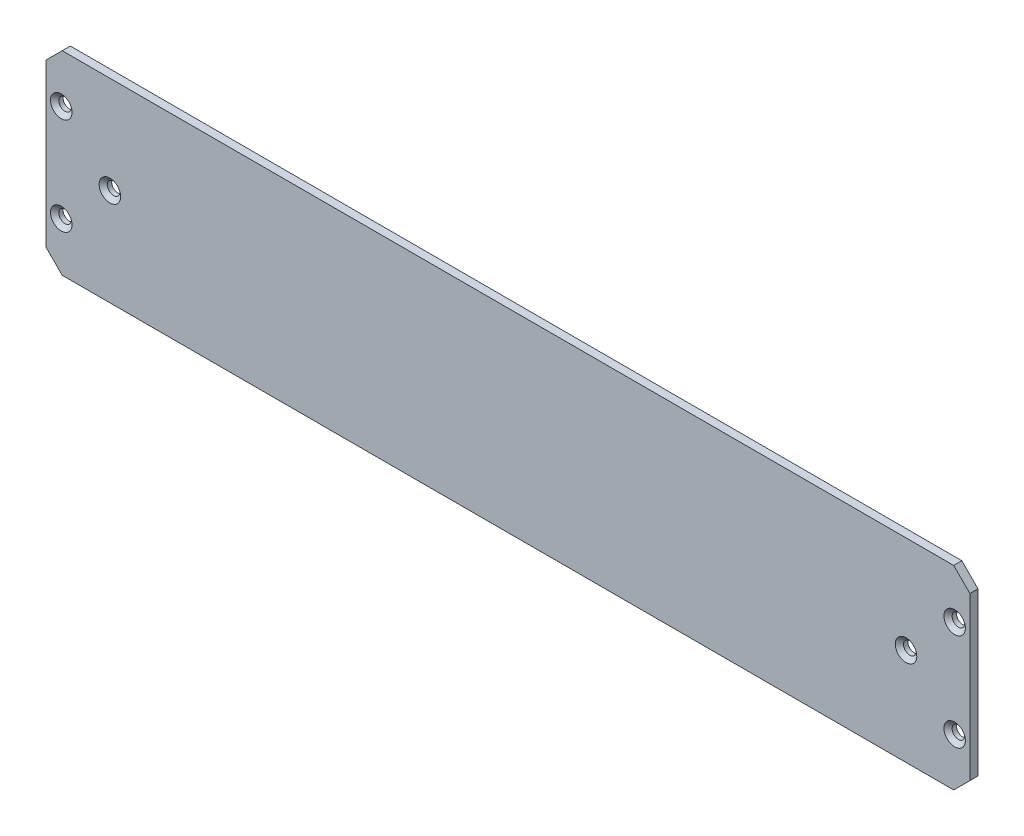
ISO-10303-21;
HEADER;
FILE_DESCRIPTION(('STEP AP214'),'2;1');
FILE_NAME('part.step','',(''),(''),'','','');
FILE_SCHEMA(('AUTOMOTIVE_DESIGN { 1 0 10303 214 1 1 1 1 }'));
ENDSEC;
DATA;
#1=APPLICATION_CONTEXT('core data for automotive mechanical design processes');
#2=APPLICATION_PROTOCOL_DEFINITION('international standard','automotive_design',2000,#1);
#3=PRODUCT_CONTEXT('',#1,'mechanical');
#4=PRODUCT('Part','Part','',(#3));
#5=PRODUCT_RELATED_PRODUCT_CATEGORY('part','',(#4));
#6=PRODUCT_DEFINITION_FORMATION('','',#4);
#7=PRODUCT_DEFINITION_CONTEXT('part definition',#1,'design');
#8=PRODUCT_DEFINITION('design','',#6,#7);
#9=PRODUCT_DEFINITION_SHAPE('','',#8);
#10=(LENGTH_UNIT() NAMED_UNIT(*) SI_UNIT(.MILLI.,.METRE.));
#11=(NAMED_UNIT(*) PLANE_ANGLE_UNIT() SI_UNIT($,.RADIAN.));
#12=(NAMED_UNIT(*) SI_UNIT($,.STERADIAN.) SOLID_ANGLE_UNIT());
#13=UNCERTAINTY_MEASURE_WITH_UNIT(LENGTH_MEASURE(1.E-05),#10,'distance_accuracy_value','');
#14=(GEOMETRIC_REPRESENTATION_CONTEXT(3) GLOBAL_UNCERTAINTY_ASSIGNED_CONTEXT((#13)) GLOBAL_UNIT_ASSIGNED_CONTEXT((#10,
#11,#12)) REPRESENTATION_CONTEXT('',''));
#15=CARTESIAN_POINT('',(0.,0.,0.));
#16=DIRECTION('',(0.,0.,1.));
#17=DIRECTION('',(1.,0.,0.));
#18=AXIS2_PLACEMENT_3D('',#15,#16,#17);
#19=CARTESIAN_POINT('',(-180.975,38.1,3.175));
#20=DIRECTION('',(1.,0.,0.));
#21=DIRECTION('',(0.,0.,-1.));
#22=AXIS2_PLACEMENT_3D('',#19,#20,#21);
#23=PLANE('',#22);
#24=DIRECTION('',(0.,-1.,0.));
#25=VECTOR('',#24,1.);
#26=CARTESIAN_POINT('',(-180.975,38.1,3.175));
#27=LINE('',#26,#25);
#28=CARTESIAN_POINT('',(-180.975,31.75,3.175));
#29=VERTEX_POINT('',#28);
#30=CARTESIAN_POINT('',(-180.975,-31.75,3.175));
#31=VERTEX_POINT('',#30);
#32=EDGE_CURVE('E122',#29,#31,#27,.T.);
#33=ORIENTED_EDGE('',*,*,#32,.F.);
#34=DIRECTION('',(0.,0.,-1.));
#35=VECTOR('',#34,1.);
#36=CARTESIAN_POINT('',(-180.975,31.75,3.175));
#37=LINE('',#36,#35);
#38=CARTESIAN_POINT('',(-180.975,31.75,0.));
#39=VERTEX_POINT('',#38);
#40=EDGE_CURVE('E107',#29,#39,#37,.T.);
#41=ORIENTED_EDGE('',*,*,#40,.T.);
#42=DIRECTION('',(0.,-1.,0.));
#43=VECTOR('',#42,1.);
#44=CARTESIAN_POINT('',(-180.975,38.1,0.));
#45=LINE('',#44,#43);
#46=CARTESIAN_POINT('',(-180.975,-31.75,0.));
#47=VERTEX_POINT('',#46);
#48=EDGE_CURVE('E119',#39,#47,#45,.T.);
#49=ORIENTED_EDGE('',*,*,#48,.T.);
#50=DIRECTION('',(0.,0.,1.));
#51=VECTOR('',#50,1.);
#52=CARTESIAN_POINT('',(-180.975,-31.75,3.175));
#53=LINE('',#52,#51);
#54=EDGE_CURVE('E124',#47,#31,#53,.T.);
#55=ORIENTED_EDGE('',*,*,#54,.T.);
#56=EDGE_LOOP('',(#33,#41,#49,#55));
#57=FACE_BOUND('',#56,.T.);
#58=ADVANCED_FACE('F37',(#57),#23,.F.);
#59=CARTESIAN_POINT('',(180.975,-38.1,3.175));
#60=DIRECTION('',(0.,1.,0.));
#61=DIRECTION('',(-1.,0.,0.));
#62=AXIS2_PLACEMENT_3D('',#59,#60,#61);
#63=PLANE('',#62);
#64=DIRECTION('',(1.,0.,0.));
#65=VECTOR('',#64,1.);
#66=CARTESIAN_POINT('',(180.975,-38.1,3.175));
#67=LINE('',#66,#65);
#68=CARTESIAN_POINT('',(-174.625,-38.1,3.175));
#69=VERTEX_POINT('',#68);
#70=CARTESIAN_POINT('',(174.625,-38.1,3.175));
#71=VERTEX_POINT('',#70);
#72=EDGE_CURVE('E177',#69,#71,#67,.T.);
#73=ORIENTED_EDGE('',*,*,#72,.F.);
#74=DIRECTION('',(0.,0.,-1.));
#75=VECTOR('',#74,1.);
#76=CARTESIAN_POINT('',(-174.625,-38.1,3.175));
#77=LINE('',#76,#75);
#78=CARTESIAN_POINT('',(-174.625,-38.1,0.));
#79=VERTEX_POINT('',#78);
#80=EDGE_CURVE('E161',#69,#79,#77,.T.);
#81=ORIENTED_EDGE('',*,*,#80,.T.);
#82=DIRECTION('',(1.,0.,0.));
#83=VECTOR('',#82,1.);
#84=CARTESIAN_POINT('',(180.975,-38.1,0.));
#85=LINE('',#84,#83);
#86=CARTESIAN_POINT('',(174.625,-38.1,0.));
#87=VERTEX_POINT('',#86);
#88=EDGE_CURVE('E128',#79,#87,#85,.T.);
#89=ORIENTED_EDGE('',*,*,#88,.T.);
#90=DIRECTION('',(0.,0.,1.));
#91=VECTOR('',#90,1.);
#92=CARTESIAN_POINT('',(174.625,-38.1,3.175));
#93=LINE('',#92,#91);
#94=EDGE_CURVE('E159',#87,#71,#93,.T.);
#95=ORIENTED_EDGE('',*,*,#94,.T.);
#96=EDGE_LOOP('',(#73,#81,#89,#95));
#97=FACE_BOUND('',#96,.T.);
#98=ADVANCED_FACE('F265',(#97),#63,.F.);
#99=CARTESIAN_POINT('',(180.975,38.1,3.175));
#100=DIRECTION('',(-1.,0.,0.));
#101=DIRECTION('',(0.,0.,1.));
#102=AXIS2_PLACEMENT_3D('',#99,#100,#101);
#103=PLANE('',#102);
#104=DIRECTION('',(0.,1.,0.));
#105=VECTOR('',#104,1.);
#106=CARTESIAN_POINT('',(180.975,38.1,0.));
#107=LINE('',#106,#105);
#108=CARTESIAN_POINT('',(180.975,-31.7499999999999,0.));
#109=VERTEX_POINT('',#108);
#110=CARTESIAN_POINT('',(180.975,31.75,0.));
#111=VERTEX_POINT('',#110);
#112=EDGE_CURVE('E132',#109,#111,#107,.T.);
#113=ORIENTED_EDGE('',*,*,#112,.T.);
#114=DIRECTION('',(0.,0.,1.));
#115=VECTOR('',#114,1.);
#116=CARTESIAN_POINT('',(180.975,31.75,3.175));
#117=LINE('',#116,#115);
#118=CARTESIAN_POINT('',(180.975,31.75,3.175));
#119=VERTEX_POINT('',#118);
#120=EDGE_CURVE('E11',#111,#119,#117,.T.);
#121=ORIENTED_EDGE('',*,*,#120,.T.);
#122=DIRECTION('',(0.,1.,0.));
#123=VECTOR('',#122,1.);
#124=CARTESIAN_POINT('',(180.975,38.1,3.175));
#125=LINE('',#124,#123);
#126=CARTESIAN_POINT('',(180.975,-31.7499999999999,3.175));
#127=VERTEX_POINT('',#126);
#128=EDGE_CURVE('E167',#127,#119,#125,.T.);
#129=ORIENTED_EDGE('',*,*,#128,.F.);
#130=DIRECTION('',(0.,0.,-1.));
#131=VECTOR('',#130,1.);
#132=CARTESIAN_POINT('',(180.975,-31.75,3.175));
#133=LINE('',#132,#131);
#134=EDGE_CURVE('E46',#127,#109,#133,.T.);
#135=ORIENTED_EDGE('',*,*,#134,.T.);
#136=EDGE_LOOP('',(#113,#121,#129,#135));
#137=FACE_BOUND('',#136,.T.);
#138=ADVANCED_FACE('F166',(#137),#103,.F.);
#139=CARTESIAN_POINT('',(180.975,38.1,3.175));
#140=DIRECTION('',(0.,-1.,0.));
#141=DIRECTION('',(1.,0.,0.));
#142=AXIS2_PLACEMENT_3D('',#139,#140,#141);
#143=PLANE('',#142);
#144=DIRECTION('',(-1.,0.,0.));
#145=VECTOR('',#144,1.);
#146=CARTESIAN_POINT('',(180.975,38.1,0.));
#147=LINE('',#146,#145);
#148=CARTESIAN_POINT('',(174.625,38.1,0.));
#149=VERTEX_POINT('',#148);
#150=CARTESIAN_POINT('',(-174.625,38.1,0.));
#151=VERTEX_POINT('',#150);
#152=EDGE_CURVE('E142',#149,#151,#147,.T.);
#153=ORIENTED_EDGE('',*,*,#152,.T.);
#154=DIRECTION('',(0.,0.,1.));
#155=VECTOR('',#154,1.);
#156=CARTESIAN_POINT('',(-174.625,38.1,3.175));
#157=LINE('',#156,#155);
#158=CARTESIAN_POINT('',(-174.625,38.1,3.175));
#159=VERTEX_POINT('',#158);
#160=EDGE_CURVE('E108',#151,#159,#157,.T.);
#161=ORIENTED_EDGE('',*,*,#160,.T.);
#162=DIRECTION('',(-1.,0.,0.));
#163=VECTOR('',#162,1.);
#164=CARTESIAN_POINT('',(180.975,38.1,3.175));
#165=LINE('',#164,#163);
#166=CARTESIAN_POINT('',(174.625,38.1,3.175));
#167=VERTEX_POINT('',#166);
#168=EDGE_CURVE('E138',#167,#159,#165,.T.);
#169=ORIENTED_EDGE('',*,*,#168,.F.);
#170=DIRECTION('',(0.,0.,-1.));
#171=VECTOR('',#170,1.);
#172=CARTESIAN_POINT('',(174.625,38.1,3.175));
#173=LINE('',#172,#171);
#174=EDGE_CURVE('E113',#167,#149,#173,.T.);
#175=ORIENTED_EDGE('',*,*,#174,.T.);
#176=EDGE_LOOP('',(#153,#161,#169,#175));
#177=FACE_BOUND('',#176,.T.);
#178=ADVANCED_FACE('F175',(#177),#143,.F.);
#179=CARTESIAN_POINT('',(0.,0.,3.175));
#180=DIRECTION('',(0.,0.,-1.));
#181=DIRECTION('',(-1.,0.,0.));
#182=AXIS2_PLACEMENT_3D('',#179,#180,#181);
#183=PLANE('',#182);
#184=CARTESIAN_POINT('',(174.999999994103,19.05,3.175));
#185=DIRECTION('',(0.,0.,1.));
#186=DIRECTION('',(1.,0.,0.));
#187=AXIS2_PLACEMENT_3D('',#184,#185,#186);
#188=CIRCLE('',#187,4.21640000000001);
#189=CARTESIAN_POINT('',(179.216399994103,19.05,3.175));
#190=VERTEX_POINT('',#189);
#191=EDGE_CURVE('E228',#190,#190,#188,.T.);
#192=ORIENTED_EDGE('',*,*,#191,.F.);
#193=EDGE_LOOP('',(#192));
#194=FACE_BOUND('',#193,.T.);
#195=CARTESIAN_POINT('',(174.999999994103,-19.05,3.175));
#196=DIRECTION('',(0.,0.,1.));
#197=DIRECTION('',(1.,0.,0.));
#198=AXIS2_PLACEMENT_3D('',#195,#196,#197);
#199=CIRCLE('',#198,4.21640000000001);
#200=CARTESIAN_POINT('',(179.216399994103,-19.05,3.175));
#201=VERTEX_POINT('',#200);
#202=EDGE_CURVE('E219',#201,#201,#199,.T.);
#203=ORIENTED_EDGE('',*,*,#202,.F.);
#204=EDGE_LOOP('',(#203));
#205=FACE_BOUND('',#204,.T.);
#206=CARTESIAN_POINT('',(155.949999994103,0.,3.175));
#207=DIRECTION('',(0.,0.,1.));
#208=DIRECTION('',(1.,0.,0.));
#209=AXIS2_PLACEMENT_3D('',#206,#207,#208);
#210=CIRCLE('',#209,4.21640000000001);
#211=CARTESIAN_POINT('',(160.166399994103,0.,3.175));
#212=VERTEX_POINT('',#211);
#213=EDGE_CURVE('E210',#212,#212,#210,.T.);
#214=ORIENTED_EDGE('',*,*,#213,.F.);
#215=EDGE_LOOP('',(#214));
#216=FACE_BOUND('',#215,.T.);
#217=CARTESIAN_POINT('',(-155.949999994103,0.,3.175));
#218=DIRECTION('',(0.,0.,1.));
#219=DIRECTION('',(1.,0.,0.));
#220=AXIS2_PLACEMENT_3D('',#217,#218,#219);
#221=CIRCLE('',#220,4.21640000000001);
#222=CARTESIAN_POINT('',(-151.733599994103,0.,3.175));
#223=VERTEX_POINT('',#222);
#224=EDGE_CURVE('E201',#223,#223,#221,.T.);
#225=ORIENTED_EDGE('',*,*,#224,.F.);
#226=EDGE_LOOP('',(#225));
#227=FACE_BOUND('',#226,.T.);
#228=CARTESIAN_POINT('',(-174.999999994103,-19.05,3.175));
#229=DIRECTION('',(0.,0.,1.));
#230=DIRECTION('',(1.,0.,0.));
#231=AXIS2_PLACEMENT_3D('',#228,#229,#230);
#232=CIRCLE('',#231,4.21640000000001);
#233=CARTESIAN_POINT('',(-170.783599994103,-19.05,3.175));
#234=VERTEX_POINT('',#233);
#235=EDGE_CURVE('E192',#234,#234,#232,.T.);
#236=ORIENTED_EDGE('',*,*,#235,.F.);
#237=EDGE_LOOP('',(#236));
#238=FACE_BOUND('',#237,.T.);
#239=CARTESIAN_POINT('',(-174.999999994103,19.05,3.175));
#240=DIRECTION('',(0.,0.,1.));
#241=DIRECTION('',(1.,0.,0.));
#242=AXIS2_PLACEMENT_3D('',#239,#240,#241);
#243=CIRCLE('',#242,4.21640000000001);
#244=CARTESIAN_POINT('',(-170.783599994103,19.05,3.175));
#245=VERTEX_POINT('',#244);
#246=EDGE_CURVE('E183',#245,#245,#243,.T.);
#247=ORIENTED_EDGE('',*,*,#246,.F.);
#248=EDGE_LOOP('',(#247));
#249=FACE_BOUND('',#248,.T.);
#250=ORIENTED_EDGE('',*,*,#168,.T.);
#251=DIRECTION('',(0.707106781186551,0.707106781186544,0.));
#252=VECTOR('',#251,1.);
#253=CARTESIAN_POINT('',(-180.975,31.75,3.175));
#254=LINE('',#253,#252);
#255=EDGE_CURVE('E157',#159,#29,#254,.F.);
#256=ORIENTED_EDGE('',*,*,#255,.T.);
#257=ORIENTED_EDGE('',*,*,#32,.T.);
#258=DIRECTION('',(-0.707106781186544,0.707106781186551,0.));
#259=VECTOR('',#258,1.);
#260=CARTESIAN_POINT('',(-174.625,-38.1,3.175));
#261=LINE('',#260,#259);
#262=EDGE_CURVE('E155',#31,#69,#261,.F.);
#263=ORIENTED_EDGE('',*,*,#262,.T.);
#264=ORIENTED_EDGE('',*,*,#72,.T.);
#265=DIRECTION('',(-0.707106781186551,-0.707106781186544,0.));
#266=VECTOR('',#265,1.);
#267=CARTESIAN_POINT('',(180.975,-31.75,3.175));
#268=LINE('',#267,#266);
#269=EDGE_CURVE('E58',#71,#127,#268,.F.);
#270=ORIENTED_EDGE('',*,*,#269,.T.);
#271=ORIENTED_EDGE('',*,*,#128,.T.);
#272=DIRECTION('',(0.707106781186544,-0.707106781186551,0.));
#273=VECTOR('',#272,1.);
#274=CARTESIAN_POINT('',(174.625,38.1,3.175));
#275=LINE('',#274,#273);
#276=EDGE_CURVE('E153',#119,#167,#275,.F.);
#277=ORIENTED_EDGE('',*,*,#276,.T.);
#278=EDGE_LOOP('',(#250,#256,#257,#263,#264,#270,#271,#277));
#279=FACE_BOUND('',#278,.T.);
#280=ADVANCED_FACE('F234',(#194,#205,#216,#227,#238,#249,#279),#183,.F.);
#281=CARTESIAN_POINT('',(0.,0.,0.));
#282=DIRECTION('',(0.,0.,-1.));
#283=DIRECTION('',(-1.,0.,0.));
#284=AXIS2_PLACEMENT_3D('',#281,#282,#283);
#285=PLANE('',#284);
#286=CARTESIAN_POINT('',(174.999999994103,19.05,0.));
#287=DIRECTION('',(0.,0.,1.));
#288=DIRECTION('',(1.,0.,0.));
#289=AXIS2_PLACEMENT_3D('',#286,#287,#288);
#290=CIRCLE('',#289,2.45745);
#291=CARTESIAN_POINT('',(177.457449994103,19.05,0.));
#292=VERTEX_POINT('',#291);
#293=EDGE_CURVE('E222',#292,#292,#290,.T.);
#294=ORIENTED_EDGE('',*,*,#293,.T.);
#295=EDGE_LOOP('',(#294));
#296=FACE_BOUND('',#295,.T.);
#297=CARTESIAN_POINT('',(174.999999994103,-19.05,0.));
#298=DIRECTION('',(0.,0.,1.));
#299=DIRECTION('',(1.,0.,0.));
#300=AXIS2_PLACEMENT_3D('',#297,#298,#299);
#301=CIRCLE('',#300,2.45745);
#302=CARTESIAN_POINT('',(177.457449994103,-19.05,0.));
#303=VERTEX_POINT('',#302);
#304=EDGE_CURVE('E213',#303,#303,#301,.T.);
#305=ORIENTED_EDGE('',*,*,#304,.T.);
#306=EDGE_LOOP('',(#305));
#307=FACE_BOUND('',#306,.T.);
#308=CARTESIAN_POINT('',(155.949999994103,0.,0.));
#309=DIRECTION('',(0.,0.,1.));
#310=DIRECTION('',(1.,0.,0.));
#311=AXIS2_PLACEMENT_3D('',#308,#309,#310);
#312=CIRCLE('',#311,2.45745);
#313=CARTESIAN_POINT('',(158.407449994103,0.,0.));
#314=VERTEX_POINT('',#313);
#315=EDGE_CURVE('E204',#314,#314,#312,.T.);
#316=ORIENTED_EDGE('',*,*,#315,.T.);
#317=EDGE_LOOP('',(#316));
#318=FACE_BOUND('',#317,.T.);
#319=CARTESIAN_POINT('',(-155.949999994103,0.,0.));
#320=DIRECTION('',(0.,0.,1.));
#321=DIRECTION('',(1.,0.,0.));
#322=AXIS2_PLACEMENT_3D('',#319,#320,#321);
#323=CIRCLE('',#322,2.45745);
#324=CARTESIAN_POINT('',(-153.492549994103,0.,0.));
#325=VERTEX_POINT('',#324);
#326=EDGE_CURVE('E195',#325,#325,#323,.T.);
#327=ORIENTED_EDGE('',*,*,#326,.T.);
#328=EDGE_LOOP('',(#327));
#329=FACE_BOUND('',#328,.T.);
#330=CARTESIAN_POINT('',(-174.999999994103,-19.05,0.));
#331=DIRECTION('',(0.,0.,1.));
#332=DIRECTION('',(1.,0.,0.));
#333=AXIS2_PLACEMENT_3D('',#330,#331,#332);
#334=CIRCLE('',#333,2.45745);
#335=CARTESIAN_POINT('',(-172.542549994103,-19.05,0.));
#336=VERTEX_POINT('',#335);
#337=EDGE_CURVE('E186',#336,#336,#334,.T.);
#338=ORIENTED_EDGE('',*,*,#337,.T.);
#339=EDGE_LOOP('',(#338));
#340=FACE_BOUND('',#339,.T.);
#341=CARTESIAN_POINT('',(-174.999999994103,19.05,0.));
#342=DIRECTION('',(0.,0.,1.));
#343=DIRECTION('',(1.,0.,0.));
#344=AXIS2_PLACEMENT_3D('',#341,#342,#343);
#345=CIRCLE('',#344,2.45745);
#346=CARTESIAN_POINT('',(-172.542549994103,19.05,0.));
#347=VERTEX_POINT('',#346);
#348=EDGE_CURVE('E129',#347,#347,#345,.T.);
#349=ORIENTED_EDGE('',*,*,#348,.T.);
#350=EDGE_LOOP('',(#349));
#351=FACE_BOUND('',#350,.T.);
#352=ORIENTED_EDGE('',*,*,#48,.F.);
#353=DIRECTION('',(-0.707106781186551,-0.707106781186544,0.));
#354=VECTOR('',#353,1.);
#355=CARTESIAN_POINT('',(-106.362499999999,106.3625,0.));
#356=LINE('',#355,#354);
#357=EDGE_CURVE('E103',#39,#151,#356,.F.);
#358=ORIENTED_EDGE('',*,*,#357,.T.);
#359=ORIENTED_EDGE('',*,*,#152,.F.);
#360=DIRECTION('',(-0.707106781186544,0.707106781186551,0.));
#361=VECTOR('',#360,1.);
#362=CARTESIAN_POINT('',(106.362500000001,106.3625,0.));
#363=LINE('',#362,#361);
#364=EDGE_CURVE('E146',#149,#111,#363,.F.);
#365=ORIENTED_EDGE('',*,*,#364,.T.);
#366=ORIENTED_EDGE('',*,*,#112,.F.);
#367=DIRECTION('',(0.707106781186551,0.707106781186544,0.));
#368=VECTOR('',#367,1.);
#369=CARTESIAN_POINT('',(106.362499999999,-106.3625,0.));
#370=LINE('',#369,#368);
#371=EDGE_CURVE('E123',#109,#87,#370,.F.);
#372=ORIENTED_EDGE('',*,*,#371,.T.);
#373=ORIENTED_EDGE('',*,*,#88,.F.);
#374=DIRECTION('',(0.707106781186544,-0.707106781186551,0.));
#375=VECTOR('',#374,1.);
#376=CARTESIAN_POINT('',(-106.362500000001,-106.3625,0.));
#377=LINE('',#376,#375);
#378=EDGE_CURVE('E114',#79,#47,#377,.F.);
#379=ORIENTED_EDGE('',*,*,#378,.T.);
#380=EDGE_LOOP('',(#352,#358,#359,#365,#366,#372,#373,#379));
#381=FACE_BOUND('',#380,.T.);
#382=ADVANCED_FACE('F126',(#296,#307,#318,#329,#340,#351,#381),#285,.T.);
#383=CARTESIAN_POINT('',(-174.999999994103,19.05,3.175));
#384=DIRECTION('',(0.,0.,1.));
#385=DIRECTION('',(1.,0.,0.));
#386=AXIS2_PLACEMENT_3D('',#383,#384,#385);
#387=CYLINDRICAL_SURFACE('',#386,2.45745);
#388=ORIENTED_EDGE('',*,*,#348,.F.);
#389=EDGE_LOOP('',(#388));
#390=FACE_BOUND('',#389,.T.);
#391=CARTESIAN_POINT('',(-174.999999994103,19.05,1.69906570374072));
#392=DIRECTION('',(0.,0.,1.));
#393=DIRECTION('',(1.,0.,0.));
#394=AXIS2_PLACEMENT_3D('',#391,#392,#393);
#395=CIRCLE('',#394,2.45745);
#396=CARTESIAN_POINT('',(-172.542549994103,19.05,1.69906570374072));
#397=VERTEX_POINT('',#396);
#398=EDGE_CURVE('E135',#397,#397,#395,.T.);
#399=ORIENTED_EDGE('',*,*,#398,.T.);
#400=EDGE_LOOP('',(#399));
#401=FACE_BOUND('',#400,.T.);
#402=ADVANCED_FACE('F251',(#390,#401),#387,.F.);
#403=CARTESIAN_POINT('',(-174.999999994103,19.05,3.175));
#404=DIRECTION('',(0.,0.,1.));
#405=DIRECTION('',(1.,0.,0.));
#406=AXIS2_PLACEMENT_3D('',#403,#404,#405);
#407=CONICAL_SURFACE('',#406,4.21640000000001,0.872664625997166);
#408=ORIENTED_EDGE('',*,*,#398,.F.);
#409=EDGE_LOOP('',(#408));
#410=FACE_BOUND('',#409,.T.);
#411=ORIENTED_EDGE('',*,*,#246,.T.);
#412=EDGE_LOOP('',(#411));
#413=FACE_BOUND('',#412,.T.);
#414=ADVANCED_FACE('F248',(#410,#413),#407,.F.);
#415=CARTESIAN_POINT('',(-174.999999994103,-19.05,3.175));
#416=DIRECTION('',(0.,0.,1.));
#417=DIRECTION('',(1.,0.,0.));
#418=AXIS2_PLACEMENT_3D('',#415,#416,#417);
#419=CYLINDRICAL_SURFACE('',#418,2.45745);
#420=ORIENTED_EDGE('',*,*,#337,.F.);
#421=EDGE_LOOP('',(#420));
#422=FACE_BOUND('',#421,.T.);
#423=CARTESIAN_POINT('',(-174.999999994103,-19.05,1.69906570374072));
#424=DIRECTION('',(0.,0.,1.));
#425=DIRECTION('',(1.,0.,0.));
#426=AXIS2_PLACEMENT_3D('',#423,#424,#425);
#427=CIRCLE('',#426,2.45745);
#428=CARTESIAN_POINT('',(-172.542549994103,-19.05,1.69906570374072));
#429=VERTEX_POINT('',#428);
#430=EDGE_CURVE('E189',#429,#429,#427,.T.);
#431=ORIENTED_EDGE('',*,*,#430,.T.);
#432=EDGE_LOOP('',(#431));
#433=FACE_BOUND('',#432,.T.);
#434=ADVANCED_FACE('F250',(#422,#433),#419,.F.);
#435=CARTESIAN_POINT('',(-174.999999994103,-19.05,3.175));
#436=DIRECTION('',(0.,0.,1.));
#437=DIRECTION('',(1.,0.,0.));
#438=AXIS2_PLACEMENT_3D('',#435,#436,#437);
#439=CONICAL_SURFACE('',#438,4.21640000000001,0.872664625997166);
#440=ORIENTED_EDGE('',*,*,#430,.F.);
#441=EDGE_LOOP('',(#440));
#442=FACE_BOUND('',#441,.T.);
#443=ORIENTED_EDGE('',*,*,#235,.T.);
#444=EDGE_LOOP('',(#443));
#445=FACE_BOUND('',#444,.T.);
#446=ADVANCED_FACE('F258',(#442,#445),#439,.F.);
#447=CARTESIAN_POINT('',(-155.949999994103,0.,3.175));
#448=DIRECTION('',(0.,0.,1.));
#449=DIRECTION('',(1.,0.,0.));
#450=AXIS2_PLACEMENT_3D('',#447,#448,#449);
#451=CYLINDRICAL_SURFACE('',#450,2.45745);
#452=ORIENTED_EDGE('',*,*,#326,.F.);
#453=EDGE_LOOP('',(#452));
#454=FACE_BOUND('',#453,.T.);
#455=CARTESIAN_POINT('',(-155.949999994103,0.,1.69906570374072));
#456=DIRECTION('',(0.,0.,1.));
#457=DIRECTION('',(1.,0.,0.));
#458=AXIS2_PLACEMENT_3D('',#455,#456,#457);
#459=CIRCLE('',#458,2.45745);
#460=CARTESIAN_POINT('',(-153.492549994103,0.,1.69906570374072));
#461=VERTEX_POINT('',#460);
#462=EDGE_CURVE('E198',#461,#461,#459,.T.);
#463=ORIENTED_EDGE('',*,*,#462,.T.);
#464=EDGE_LOOP('',(#463));
#465=FACE_BOUND('',#464,.T.);
#466=ADVANCED_FACE('F424',(#454,#465),#451,.F.);
#467=CARTESIAN_POINT('',(-155.949999994103,0.,3.175));
#468=DIRECTION('',(0.,0.,1.));
#469=DIRECTION('',(1.,0.,0.));
#470=AXIS2_PLACEMENT_3D('',#467,#468,#469);
#471=CONICAL_SURFACE('',#470,4.21640000000001,0.872664625997166);
#472=ORIENTED_EDGE('',*,*,#462,.F.);
#473=EDGE_LOOP('',(#472));
#474=FACE_BOUND('',#473,.T.);
#475=ORIENTED_EDGE('',*,*,#224,.T.);
#476=EDGE_LOOP('',(#475));
#477=FACE_BOUND('',#476,.T.);
#478=ADVANCED_FACE('F414',(#474,#477),#471,.F.);
#479=CARTESIAN_POINT('',(155.949999994103,0.,3.175));
#480=DIRECTION('',(0.,0.,1.));
#481=DIRECTION('',(1.,0.,0.));
#482=AXIS2_PLACEMENT_3D('',#479,#480,#481);
#483=CYLINDRICAL_SURFACE('',#482,2.45745);
#484=ORIENTED_EDGE('',*,*,#315,.F.);
#485=EDGE_LOOP('',(#484));
#486=FACE_BOUND('',#485,.T.);
#487=CARTESIAN_POINT('',(155.949999994103,0.,1.69906570374072));
#488=DIRECTION('',(0.,0.,1.));
#489=DIRECTION('',(1.,0.,0.));
#490=AXIS2_PLACEMENT_3D('',#487,#488,#489);
#491=CIRCLE('',#490,2.45745);
#492=CARTESIAN_POINT('',(158.407449994103,0.,1.69906570374072));
#493=VERTEX_POINT('',#492);
#494=EDGE_CURVE('E207',#493,#493,#491,.T.);
#495=ORIENTED_EDGE('',*,*,#494,.T.);
#496=EDGE_LOOP('',(#495));
#497=FACE_BOUND('',#496,.T.);
#498=ADVANCED_FACE('F404',(#486,#497),#483,.F.);
#499=CARTESIAN_POINT('',(155.949999994103,0.,3.175));
#500=DIRECTION('',(0.,0.,1.));
#501=DIRECTION('',(1.,0.,0.));
#502=AXIS2_PLACEMENT_3D('',#499,#500,#501);
#503=CONICAL_SURFACE('',#502,4.21640000000001,0.872664625997166);
#504=ORIENTED_EDGE('',*,*,#494,.F.);
#505=EDGE_LOOP('',(#504));
#506=FACE_BOUND('',#505,.T.);
#507=ORIENTED_EDGE('',*,*,#213,.T.);
#508=EDGE_LOOP('',(#507));
#509=FACE_BOUND('',#508,.T.);
#510=ADVANCED_FACE('F394',(#506,#509),#503,.F.);
#511=CARTESIAN_POINT('',(174.999999994103,-19.05,3.175));
#512=DIRECTION('',(0.,0.,1.));
#513=DIRECTION('',(1.,0.,0.));
#514=AXIS2_PLACEMENT_3D('',#511,#512,#513);
#515=CYLINDRICAL_SURFACE('',#514,2.45745);
#516=ORIENTED_EDGE('',*,*,#304,.F.);
#517=EDGE_LOOP('',(#516));
#518=FACE_BOUND('',#517,.T.);
#519=CARTESIAN_POINT('',(174.999999994103,-19.05,1.69906570374072));
#520=DIRECTION('',(0.,0.,1.));
#521=DIRECTION('',(1.,0.,0.));
#522=AXIS2_PLACEMENT_3D('',#519,#520,#521);
#523=CIRCLE('',#522,2.45745);
#524=CARTESIAN_POINT('',(177.457449994103,-19.05,1.69906570374072));
#525=VERTEX_POINT('',#524);
#526=EDGE_CURVE('E216',#525,#525,#523,.T.);
#527=ORIENTED_EDGE('',*,*,#526,.T.);
#528=EDGE_LOOP('',(#527));
#529=FACE_BOUND('',#528,.T.);
#530=ADVANCED_FACE('F384',(#518,#529),#515,.F.);
#531=CARTESIAN_POINT('',(174.999999994103,-19.05,3.175));
#532=DIRECTION('',(0.,0.,1.));
#533=DIRECTION('',(1.,0.,0.));
#534=AXIS2_PLACEMENT_3D('',#531,#532,#533);
#535=CONICAL_SURFACE('',#534,4.21640000000001,0.872664625997166);
#536=ORIENTED_EDGE('',*,*,#526,.F.);
#537=EDGE_LOOP('',(#536));
#538=FACE_BOUND('',#537,.T.);
#539=ORIENTED_EDGE('',*,*,#202,.T.);
#540=EDGE_LOOP('',(#539));
#541=FACE_BOUND('',#540,.T.);
#542=ADVANCED_FACE('F374',(#538,#541),#535,.F.);
#543=CARTESIAN_POINT('',(174.999999994103,19.05,3.175));
#544=DIRECTION('',(0.,0.,1.));
#545=DIRECTION('',(1.,0.,0.));
#546=AXIS2_PLACEMENT_3D('',#543,#544,#545);
#547=CYLINDRICAL_SURFACE('',#546,2.45745);
#548=ORIENTED_EDGE('',*,*,#293,.F.);
#549=EDGE_LOOP('',(#548));
#550=FACE_BOUND('',#549,.T.);
#551=CARTESIAN_POINT('',(174.999999994103,19.05,1.69906570374072));
#552=DIRECTION('',(0.,0.,1.));
#553=DIRECTION('',(1.,0.,0.));
#554=AXIS2_PLACEMENT_3D('',#551,#552,#553);
#555=CIRCLE('',#554,2.45745);
#556=CARTESIAN_POINT('',(177.457449994103,19.05,1.69906570374072));
#557=VERTEX_POINT('',#556);
#558=EDGE_CURVE('E225',#557,#557,#555,.T.);
#559=ORIENTED_EDGE('',*,*,#558,.T.);
#560=EDGE_LOOP('',(#559));
#561=FACE_BOUND('',#560,.T.);
#562=ADVANCED_FACE('F364',(#550,#561),#547,.F.);
#563=CARTESIAN_POINT('',(174.999999994103,19.05,3.175));
#564=DIRECTION('',(0.,0.,1.));
#565=DIRECTION('',(1.,0.,0.));
#566=AXIS2_PLACEMENT_3D('',#563,#564,#565);
#567=CONICAL_SURFACE('',#566,4.21640000000001,0.872664625997166);
#568=ORIENTED_EDGE('',*,*,#558,.F.);
#569=EDGE_LOOP('',(#568));
#570=FACE_BOUND('',#569,.T.);
#571=ORIENTED_EDGE('',*,*,#191,.T.);
#572=EDGE_LOOP('',(#571));
#573=FACE_BOUND('',#572,.T.);
#574=ADVANCED_FACE('F232',(#570,#573),#567,.F.);
#575=CARTESIAN_POINT('',(-180.975,31.75,3.175));
#576=DIRECTION('',(0.707106781186544,-0.707106781186551,0.));
#577=DIRECTION('',(0.,0.,-1.));
#578=AXIS2_PLACEMENT_3D('',#575,#576,#577);
#579=PLANE('',#578);
#580=ORIENTED_EDGE('',*,*,#255,.F.);
#581=ORIENTED_EDGE('',*,*,#160,.F.);
#582=ORIENTED_EDGE('',*,*,#357,.F.);
#583=ORIENTED_EDGE('',*,*,#40,.F.);
#584=EDGE_LOOP('',(#580,#581,#582,#583));
#585=FACE_BOUND('',#584,.T.);
#586=ADVANCED_FACE('F106',(#585),#579,.F.);
#587=CARTESIAN_POINT('',(-174.625,-38.1,3.175));
#588=DIRECTION('',(0.707106781186551,0.707106781186544,0.));
#589=DIRECTION('',(0.,0.,-1.));
#590=AXIS2_PLACEMENT_3D('',#587,#588,#589);
#591=PLANE('',#590);
#592=ORIENTED_EDGE('',*,*,#262,.F.);
#593=ORIENTED_EDGE('',*,*,#54,.F.);
#594=ORIENTED_EDGE('',*,*,#378,.F.);
#595=ORIENTED_EDGE('',*,*,#80,.F.);
#596=EDGE_LOOP('',(#592,#593,#594,#595));
#597=FACE_BOUND('',#596,.T.);
#598=ADVANCED_FACE('F280',(#597),#591,.F.);
#599=CARTESIAN_POINT('',(174.625,38.1,3.175));
#600=DIRECTION('',(-0.707106781186551,-0.707106781186544,0.));
#601=DIRECTION('',(0.,0.,-1.));
#602=AXIS2_PLACEMENT_3D('',#599,#600,#601);
#603=PLANE('',#602);
#604=ORIENTED_EDGE('',*,*,#276,.F.);
#605=ORIENTED_EDGE('',*,*,#120,.F.);
#606=ORIENTED_EDGE('',*,*,#364,.F.);
#607=ORIENTED_EDGE('',*,*,#174,.F.);
#608=EDGE_LOOP('',(#604,#605,#606,#607));
#609=FACE_BOUND('',#608,.T.);
#610=ADVANCED_FACE('F172',(#609),#603,.F.);
#611=CARTESIAN_POINT('',(180.975,-31.75,3.175));
#612=DIRECTION('',(-0.707106781186544,0.707106781186551,0.));
#613=DIRECTION('',(0.,0.,-1.));
#614=AXIS2_PLACEMENT_3D('',#611,#612,#613);
#615=PLANE('',#614);
#616=ORIENTED_EDGE('',*,*,#269,.F.);
#617=ORIENTED_EDGE('',*,*,#94,.F.);
#618=ORIENTED_EDGE('',*,*,#371,.F.);
#619=ORIENTED_EDGE('',*,*,#134,.F.);
#620=EDGE_LOOP('',(#616,#617,#618,#619));
#621=FACE_BOUND('',#620,.T.);
#622=ADVANCED_FACE('F40',(#621),#615,.F.);
#623=CLOSED_SHELL('',(#58,#98,#138,#178,#280,#382,#402,#414,#434,#446,#466,#478,#498,#510,#530,
#542,#562,#574,#586,#598,#610,#622));
#624=MANIFOLD_SOLID_BREP('B2',#623);
#625=ADVANCED_BREP_SHAPE_REPRESENTATION('',(#18,#624),#14);
#626=SHAPE_DEFINITION_REPRESENTATION(#9,#625);
ENDSEC;
END-ISO-10303-21;
